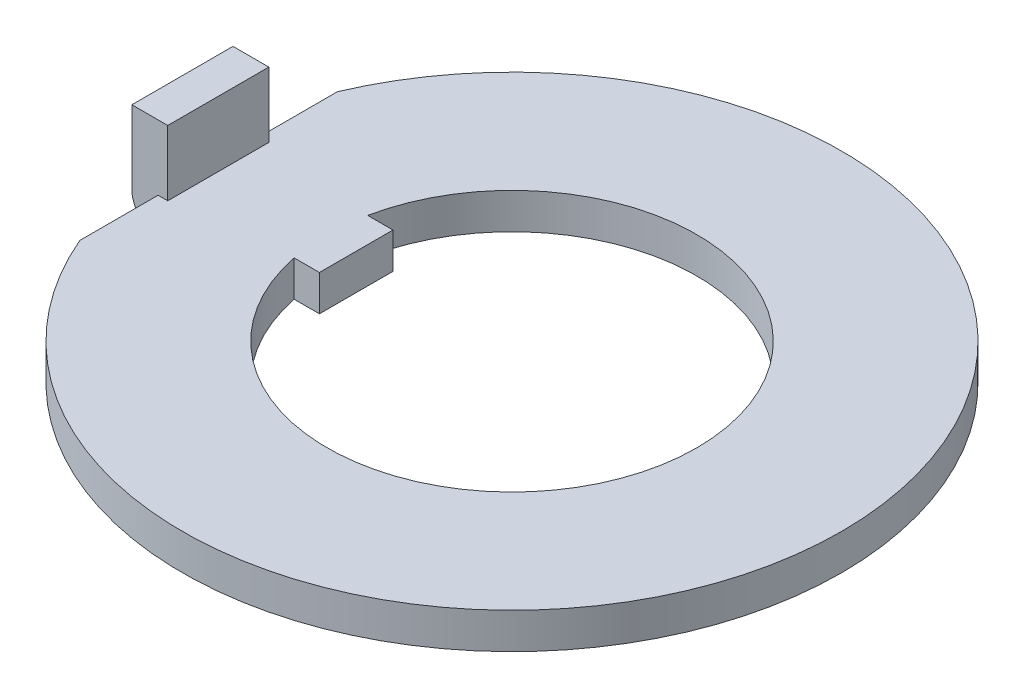
ISO-10303-21;
HEADER;
FILE_DESCRIPTION(('STEP AP214'),'2;1');
FILE_NAME('part.step','',(''),(''),'','','');
FILE_SCHEMA(('AUTOMOTIVE_DESIGN { 1 0 10303 214 1 1 1 1 }'));
ENDSEC;
DATA;
#1=APPLICATION_CONTEXT('core data for automotive mechanical design processes');
#2=APPLICATION_PROTOCOL_DEFINITION('international standard','automotive_design',2000,#1);
#3=PRODUCT_CONTEXT('',#1,'mechanical');
#4=PRODUCT('Part','Part','',(#3));
#5=PRODUCT_RELATED_PRODUCT_CATEGORY('part','',(#4));
#6=PRODUCT_DEFINITION_FORMATION('','',#4);
#7=PRODUCT_DEFINITION_CONTEXT('part definition',#1,'design');
#8=PRODUCT_DEFINITION('design','',#6,#7);
#9=PRODUCT_DEFINITION_SHAPE('','',#8);
#10=(LENGTH_UNIT() NAMED_UNIT(*) SI_UNIT(.MILLI.,.METRE.));
#11=(NAMED_UNIT(*) PLANE_ANGLE_UNIT() SI_UNIT($,.RADIAN.));
#12=(NAMED_UNIT(*) SI_UNIT($,.STERADIAN.) SOLID_ANGLE_UNIT());
#13=UNCERTAINTY_MEASURE_WITH_UNIT(LENGTH_MEASURE(1.E-05),#10,'distance_accuracy_value','');
#14=(GEOMETRIC_REPRESENTATION_CONTEXT(3) GLOBAL_UNCERTAINTY_ASSIGNED_CONTEXT((#13)) GLOBAL_UNIT_ASSIGNED_CONTEXT((#10,
#11,#12)) REPRESENTATION_CONTEXT('',''));
#15=CARTESIAN_POINT('',(0.,0.,0.));
#16=DIRECTION('',(0.,0.,1.));
#17=DIRECTION('',(1.,0.,0.));
#18=AXIS2_PLACEMENT_3D('',#15,#16,#17);
#19=CARTESIAN_POINT('',(-8.3439,0.2667,1.397));
#20=DIRECTION('',(0.,0.,1.));
#21=DIRECTION('',(1.,0.,0.));
#22=AXIS2_PLACEMENT_3D('',#19,#20,#21);
#23=PLANE('',#22);
#24=DIRECTION('',(0.,1.,0.));
#25=VECTOR('',#24,1.);
#26=CARTESIAN_POINT('',(-9.1059,2.2987,1.397));
#27=LINE('',#26,#25);
#28=CARTESIAN_POINT('',(-9.1059,2.2987,1.397));
#29=VERTEX_POINT('',#28);
#30=CARTESIAN_POINT('',(-9.1059,0.266700005677342,1.397));
#31=VERTEX_POINT('',#30);
#32=EDGE_CURVE('E205',#29,#31,#27,.F.);
#33=ORIENTED_EDGE('',*,*,#32,.T.);
#34=CARTESIAN_POINT('',(-8.3439,0.2667,1.397));
#35=DIRECTION('',(0.,0.,1.));
#36=DIRECTION('',(1.,0.,0.));
#37=AXIS2_PLACEMENT_3D('',#34,#35,#36);
#38=CIRCLE('',#37,0.762);
#39=CARTESIAN_POINT('',(-8.382,-0.494346903942195,1.397));
#40=VERTEX_POINT('',#39);
#41=EDGE_CURVE('E19',#31,#40,#38,.T.);
#42=ORIENTED_EDGE('',*,*,#41,.T.);
#43=DIRECTION('',(0.,1.,0.));
#44=VECTOR('',#43,1.);
#45=CARTESIAN_POINT('',(-8.382,0.2667,1.397));
#46=LINE('',#45,#44);
#47=CARTESIAN_POINT('',(-8.382,0.4953,1.397));
#48=VERTEX_POINT('',#47);
#49=EDGE_CURVE('E194',#40,#48,#46,.T.);
#50=ORIENTED_EDGE('',*,*,#49,.T.);
#51=DIRECTION('',(1.,0.,0.));
#52=VECTOR('',#51,1.);
#53=CARTESIAN_POINT('',(-8.3439,0.4953,1.397));
#54=LINE('',#53,#52);
#55=CARTESIAN_POINT('',(-8.1153,0.4953,1.397));
#56=VERTEX_POINT('',#55);
#57=EDGE_CURVE('E83',#48,#56,#54,.T.);
#58=ORIENTED_EDGE('',*,*,#57,.T.);
#59=DIRECTION('',(0.,1.,0.));
#60=VECTOR('',#59,1.);
#61=CARTESIAN_POINT('',(-8.1153,-0.4953,1.397));
#62=LINE('',#61,#60);
#63=CARTESIAN_POINT('',(-8.1153,2.2987,1.397));
#64=VERTEX_POINT('',#63);
#65=EDGE_CURVE('E204',#56,#64,#62,.T.);
#66=ORIENTED_EDGE('',*,*,#65,.T.);
#67=DIRECTION('',(1.,0.,0.));
#68=VECTOR('',#67,1.);
#69=CARTESIAN_POINT('',(-8.1153,2.2987,1.397));
#70=LINE('',#69,#68);
#71=EDGE_CURVE('E211',#64,#29,#70,.F.);
#72=ORIENTED_EDGE('',*,*,#71,.T.);
#73=EDGE_LOOP('',(#33,#42,#50,#58,#66,#72));
#74=FACE_BOUND('',#73,.T.);
#75=ADVANCED_FACE('F16',(#74),#23,.T.);
#76=CARTESIAN_POINT('',(-8.1153,2.2987,1.397));
#77=DIRECTION('',(0.,-1.,0.));
#78=DIRECTION('',(0.,0.,-1.));
#79=AXIS2_PLACEMENT_3D('',#76,#77,#78);
#80=PLANE('',#79);
#81=DIRECTION('',(0.,0.,-1.));
#82=VECTOR('',#81,1.);
#83=CARTESIAN_POINT('',(-9.1059,2.2987,1.397));
#84=LINE('',#83,#82);
#85=CARTESIAN_POINT('',(-9.1059,2.2987,-1.397));
#86=VERTEX_POINT('',#85);
#87=EDGE_CURVE('E214',#86,#29,#84,.F.);
#88=ORIENTED_EDGE('',*,*,#87,.T.);
#89=ORIENTED_EDGE('',*,*,#71,.F.);
#90=DIRECTION('',(0.,0.,1.));
#91=VECTOR('',#90,1.);
#92=CARTESIAN_POINT('',(-8.1153,2.2987,1.397));
#93=LINE('',#92,#91);
#94=CARTESIAN_POINT('',(-8.1153,2.2987,-1.397));
#95=VERTEX_POINT('',#94);
#96=EDGE_CURVE('E230',#64,#95,#93,.F.);
#97=ORIENTED_EDGE('',*,*,#96,.T.);
#98=DIRECTION('',(1.,0.,0.));
#99=VECTOR('',#98,1.);
#100=CARTESIAN_POINT('',(-8.3439,2.2987,-1.397));
#101=LINE('',#100,#99);
#102=EDGE_CURVE('E208',#95,#86,#101,.F.);
#103=ORIENTED_EDGE('',*,*,#102,.T.);
#104=EDGE_LOOP('',(#88,#89,#97,#103));
#105=FACE_BOUND('',#104,.T.);
#106=ADVANCED_FACE('F262',(#105),#80,.F.);
#107=CARTESIAN_POINT('',(-8.3439,0.2667,-1.397));
#108=DIRECTION('',(0.,0.,1.));
#109=DIRECTION('',(1.,0.,0.));
#110=AXIS2_PLACEMENT_3D('',#107,#108,#109);
#111=PLANE('',#110);
#112=DIRECTION('',(0.,1.,0.));
#113=VECTOR('',#112,1.);
#114=CARTESIAN_POINT('',(-8.382,0.2667,-1.397));
#115=LINE('',#114,#113);
#116=CARTESIAN_POINT('',(-8.382,-0.494346903942195,-1.397));
#117=VERTEX_POINT('',#116);
#118=CARTESIAN_POINT('',(-8.382,0.4953,-1.397));
#119=VERTEX_POINT('',#118);
#120=EDGE_CURVE('E187',#117,#119,#115,.T.);
#121=ORIENTED_EDGE('',*,*,#120,.F.);
#122=CARTESIAN_POINT('',(-8.3439,0.2667,-1.397));
#123=DIRECTION('',(0.,0.,1.));
#124=DIRECTION('',(1.,0.,0.));
#125=AXIS2_PLACEMENT_3D('',#122,#123,#124);
#126=CIRCLE('',#125,0.762);
#127=CARTESIAN_POINT('',(-9.1059,0.266700005677342,-1.397));
#128=VERTEX_POINT('',#127);
#129=EDGE_CURVE('E191',#128,#117,#126,.T.);
#130=ORIENTED_EDGE('',*,*,#129,.F.);
#131=DIRECTION('',(0.,1.,0.));
#132=VECTOR('',#131,1.);
#133=CARTESIAN_POINT('',(-9.1059,2.2987,-1.397));
#134=LINE('',#133,#132);
#135=EDGE_CURVE('E201',#128,#86,#134,.T.);
#136=ORIENTED_EDGE('',*,*,#135,.T.);
#137=ORIENTED_EDGE('',*,*,#102,.F.);
#138=DIRECTION('',(0.,1.,0.));
#139=VECTOR('',#138,1.);
#140=CARTESIAN_POINT('',(-8.1153,-0.4953,-1.397));
#141=LINE('',#140,#139);
#142=CARTESIAN_POINT('',(-8.1153,0.4953,-1.397));
#143=VERTEX_POINT('',#142);
#144=EDGE_CURVE('E200',#95,#143,#141,.F.);
#145=ORIENTED_EDGE('',*,*,#144,.T.);
#146=DIRECTION('',(1.,0.,0.));
#147=VECTOR('',#146,1.);
#148=CARTESIAN_POINT('',(-8.3439,0.4953,-1.397));
#149=LINE('',#148,#147);
#150=EDGE_CURVE('E190',#119,#143,#149,.T.);
#151=ORIENTED_EDGE('',*,*,#150,.F.);
#152=EDGE_LOOP('',(#121,#130,#136,#137,#145,#151));
#153=FACE_BOUND('',#152,.T.);
#154=ADVANCED_FACE('F257',(#153),#111,.F.);
#155=CARTESIAN_POINT('',(-9.1059,2.2987,1.397));
#156=DIRECTION('',(1.,0.,0.));
#157=DIRECTION('',(0.,0.,-1.));
#158=AXIS2_PLACEMENT_3D('',#155,#156,#157);
#159=PLANE('',#158);
#160=DIRECTION('',(0.,0.,1.));
#161=VECTOR('',#160,1.);
#162=CARTESIAN_POINT('',(-9.1059,0.266700011354684,1.397));
#163=LINE('',#162,#161);
#164=EDGE_CURVE('E198',#31,#128,#163,.F.);
#165=ORIENTED_EDGE('',*,*,#164,.F.);
#166=ORIENTED_EDGE('',*,*,#32,.F.);
#167=ORIENTED_EDGE('',*,*,#87,.F.);
#168=ORIENTED_EDGE('',*,*,#135,.F.);
#169=EDGE_LOOP('',(#165,#166,#167,#168));
#170=FACE_BOUND('',#169,.T.);
#171=ADVANCED_FACE('F259',(#170),#159,.F.);
#172=CARTESIAN_POINT('',(-8.1153,-0.4953,1.397));
#173=DIRECTION('',(-1.,0.,0.));
#174=DIRECTION('',(0.,0.,1.));
#175=AXIS2_PLACEMENT_3D('',#172,#173,#174);
#176=PLANE('',#175);
#177=ORIENTED_EDGE('',*,*,#144,.F.);
#178=ORIENTED_EDGE('',*,*,#96,.F.);
#179=ORIENTED_EDGE('',*,*,#65,.F.);
#180=DIRECTION('',(0.,0.,1.));
#181=VECTOR('',#180,1.);
#182=CARTESIAN_POINT('',(-8.1153,0.4953,0.));
#183=LINE('',#182,#181);
#184=EDGE_CURVE('E181',#143,#56,#183,.T.);
#185=ORIENTED_EDGE('',*,*,#184,.F.);
#186=EDGE_LOOP('',(#177,#178,#179,#185));
#187=FACE_BOUND('',#186,.T.);
#188=ADVANCED_FACE('F267',(#187),#176,.F.);
#189=CARTESIAN_POINT('',(-8.3439,0.2667,1.397));
#190=DIRECTION('',(0.,0.,1.));
#191=DIRECTION('',(1.,0.,0.));
#192=AXIS2_PLACEMENT_3D('',#189,#190,#191);
#193=CYLINDRICAL_SURFACE('',#192,0.762);
#194=ORIENTED_EDGE('',*,*,#41,.F.);
#195=ORIENTED_EDGE('',*,*,#164,.T.);
#196=ORIENTED_EDGE('',*,*,#129,.T.);
#197=DIRECTION('',(0.,0.,-1.));
#198=VECTOR('',#197,1.);
#199=CARTESIAN_POINT('',(-8.382,-0.494346903942195,-3.55801782036008));
#200=LINE('',#199,#198);
#201=EDGE_CURVE('E170',#117,#40,#200,.F.);
#202=ORIENTED_EDGE('',*,*,#201,.T.);
#203=EDGE_LOOP('',(#194,#195,#196,#202));
#204=FACE_BOUND('',#203,.T.);
#205=ADVANCED_FACE('F251',(#204),#193,.T.);
#206=CARTESIAN_POINT('',(0.,0.4953,0.));
#207=DIRECTION('',(0.,1.,0.));
#208=DIRECTION('',(0.,0.,1.));
#209=AXIS2_PLACEMENT_3D('',#206,#207,#208);
#210=PLANE('',#209);
#211=DIRECTION('',(-1.,0.,0.));
#212=VECTOR('',#211,1.);
#213=CARTESIAN_POINT('',(-5.00328423737849,0.4953,-1.016));
#214=LINE('',#213,#212);
#215=CARTESIAN_POINT('',(-5.00328423737849,0.4953,-1.016));
#216=VERTEX_POINT('',#215);
#217=CARTESIAN_POINT('',(-4.3053,0.4953,-1.016));
#218=VERTEX_POINT('',#217);
#219=EDGE_CURVE('E165',#216,#218,#214,.F.);
#220=ORIENTED_EDGE('',*,*,#219,.F.);
#221=CARTESIAN_POINT('',(0.,0.4953,0.));
#222=DIRECTION('',(0.,1.,0.));
#223=DIRECTION('',(0.,0.,1.));
#224=AXIS2_PLACEMENT_3D('',#221,#222,#223);
#225=CIRCLE('',#224,5.1054);
#226=CARTESIAN_POINT('',(-5.00328423737849,0.4953,1.016));
#227=VERTEX_POINT('',#226);
#228=EDGE_CURVE('E132',#216,#227,#225,.F.);
#229=ORIENTED_EDGE('',*,*,#228,.T.);
#230=DIRECTION('',(1.,0.,0.));
#231=VECTOR('',#230,1.);
#232=CARTESIAN_POINT('',(-4.3053,0.4953,1.016));
#233=LINE('',#232,#231);
#234=CARTESIAN_POINT('',(-4.3053,0.4953,1.016));
#235=VERTEX_POINT('',#234);
#236=EDGE_CURVE('E131',#235,#227,#233,.F.);
#237=ORIENTED_EDGE('',*,*,#236,.F.);
#238=DIRECTION('',(0.,0.,-1.));
#239=VECTOR('',#238,1.);
#240=CARTESIAN_POINT('',(-4.3053,0.4953,-1.016));
#241=LINE('',#240,#239);
#242=EDGE_CURVE('E128',#218,#235,#241,.F.);
#243=ORIENTED_EDGE('',*,*,#242,.F.);
#244=EDGE_LOOP('',(#220,#229,#237,#243));
#245=FACE_BOUND('',#244,.T.);
#246=ORIENTED_EDGE('',*,*,#150,.T.);
#247=ORIENTED_EDGE('',*,*,#184,.T.);
#248=ORIENTED_EDGE('',*,*,#57,.F.);
#249=DIRECTION('',(0.,0.,-1.));
#250=VECTOR('',#249,1.);
#251=CARTESIAN_POINT('',(-8.382,0.4953,-3.55801782036008));
#252=LINE('',#251,#250);
#253=CARTESIAN_POINT('',(-8.382,0.4953,3.55801782036009));
#254=VERTEX_POINT('',#253);
#255=EDGE_CURVE('E153',#48,#254,#252,.F.);
#256=ORIENTED_EDGE('',*,*,#255,.T.);
#257=CARTESIAN_POINT('',(0.,0.4953,0.));
#258=DIRECTION('',(0.,1.,0.));
#259=DIRECTION('',(0.,0.,1.));
#260=AXIS2_PLACEMENT_3D('',#257,#258,#259);
#261=CIRCLE('',#260,9.1059);
#262=CARTESIAN_POINT('',(-8.382,0.4953,-3.55801782036009));
#263=VERTEX_POINT('',#262);
#264=EDGE_CURVE('E149',#263,#254,#261,.F.);
#265=ORIENTED_EDGE('',*,*,#264,.F.);
#266=DIRECTION('',(0.,0.,-1.));
#267=VECTOR('',#266,1.);
#268=CARTESIAN_POINT('',(-8.382,0.4953,-3.55801782036008));
#269=LINE('',#268,#267);
#270=EDGE_CURVE('E154',#263,#119,#269,.F.);
#271=ORIENTED_EDGE('',*,*,#270,.T.);
#272=EDGE_LOOP('',(#246,#247,#248,#256,#265,#271));
#273=FACE_BOUND('',#272,.T.);
#274=ADVANCED_FACE('F269',(#245,#273),#210,.T.);
#275=CARTESIAN_POINT('',(-4.3053,0.4953,-1.016));
#276=DIRECTION('',(1.,0.,0.));
#277=DIRECTION('',(0.,0.,-1.));
#278=AXIS2_PLACEMENT_3D('',#275,#276,#277);
#279=PLANE('',#278);
#280=ORIENTED_EDGE('',*,*,#242,.T.);
#281=DIRECTION('',(0.,1.,0.));
#282=VECTOR('',#281,1.);
#283=CARTESIAN_POINT('',(-4.3053,0.4953,1.016));
#284=LINE('',#283,#282);
#285=CARTESIAN_POINT('',(-4.3053,-0.4953,1.016));
#286=VERTEX_POINT('',#285);
#287=EDGE_CURVE('E125',#286,#235,#284,.T.);
#288=ORIENTED_EDGE('',*,*,#287,.F.);
#289=DIRECTION('',(0.,0.,1.));
#290=VECTOR('',#289,1.);
#291=CARTESIAN_POINT('',(-4.3053,-0.4953,0.));
#292=LINE('',#291,#290);
#293=CARTESIAN_POINT('',(-4.3053,-0.4953,-1.016));
#294=VERTEX_POINT('',#293);
#295=EDGE_CURVE('E112',#286,#294,#292,.F.);
#296=ORIENTED_EDGE('',*,*,#295,.T.);
#297=DIRECTION('',(0.,1.,0.));
#298=VECTOR('',#297,1.);
#299=CARTESIAN_POINT('',(-4.3053,0.4953,-1.016));
#300=LINE('',#299,#298);
#301=EDGE_CURVE('E163',#218,#294,#300,.F.);
#302=ORIENTED_EDGE('',*,*,#301,.F.);
#303=EDGE_LOOP('',(#280,#288,#296,#302));
#304=FACE_BOUND('',#303,.T.);
#305=ADVANCED_FACE('F126',(#304),#279,.T.);
#306=CARTESIAN_POINT('',(-5.00328423737849,0.4953,-1.016));
#307=DIRECTION('',(0.,0.,-1.));
#308=DIRECTION('',(-1.,0.,0.));
#309=AXIS2_PLACEMENT_3D('',#306,#307,#308);
#310=PLANE('',#309);
#311=ORIENTED_EDGE('',*,*,#219,.T.);
#312=ORIENTED_EDGE('',*,*,#301,.T.);
#313=DIRECTION('',(1.,0.,0.));
#314=VECTOR('',#313,1.);
#315=CARTESIAN_POINT('',(0.,-0.4953,-1.016));
#316=LINE('',#315,#314);
#317=CARTESIAN_POINT('',(-5.00328423737849,-0.4953,-1.016));
#318=VERTEX_POINT('',#317);
#319=EDGE_CURVE('E120',#294,#318,#316,.F.);
#320=ORIENTED_EDGE('',*,*,#319,.T.);
#321=DIRECTION('',(0.,1.,0.));
#322=VECTOR('',#321,1.);
#323=CARTESIAN_POINT('',(-5.00328423737849,0.4953,-1.016));
#324=LINE('',#323,#322);
#325=EDGE_CURVE('E160',#318,#216,#324,.T.);
#326=ORIENTED_EDGE('',*,*,#325,.T.);
#327=EDGE_LOOP('',(#311,#312,#320,#326));
#328=FACE_BOUND('',#327,.T.);
#329=ADVANCED_FACE('F296',(#328),#310,.T.);
#330=CARTESIAN_POINT('',(0.,0.4953,0.));
#331=DIRECTION('',(0.,1.,0.));
#332=DIRECTION('',(0.,0.,1.));
#333=AXIS2_PLACEMENT_3D('',#330,#331,#332);
#334=CYLINDRICAL_SURFACE('',#333,5.1054);
#335=DIRECTION('',(0.,1.,0.));
#336=VECTOR('',#335,1.);
#337=CARTESIAN_POINT('',(-5.00328423737849,0.4953,1.016));
#338=LINE('',#337,#336);
#339=CARTESIAN_POINT('',(-5.00328423737849,-0.4953,1.016));
#340=VERTEX_POINT('',#339);
#341=EDGE_CURVE('E136',#227,#340,#338,.F.);
#342=ORIENTED_EDGE('',*,*,#341,.F.);
#343=ORIENTED_EDGE('',*,*,#228,.F.);
#344=ORIENTED_EDGE('',*,*,#325,.F.);
#345=CARTESIAN_POINT('',(0.,-0.4953,0.));
#346=DIRECTION('',(0.,1.,0.));
#347=DIRECTION('',(0.,0.,1.));
#348=AXIS2_PLACEMENT_3D('',#345,#346,#347);
#349=CIRCLE('',#348,5.1054);
#350=EDGE_CURVE('E137',#318,#340,#349,.F.);
#351=ORIENTED_EDGE('',*,*,#350,.T.);
#352=EDGE_LOOP('',(#342,#343,#344,#351));
#353=FACE_BOUND('',#352,.T.);
#354=ADVANCED_FACE('F293',(#353),#334,.F.);
#355=CARTESIAN_POINT('',(-4.3053,0.4953,1.016));
#356=DIRECTION('',(0.,0.,1.));
#357=DIRECTION('',(1.,0.,0.));
#358=AXIS2_PLACEMENT_3D('',#355,#356,#357);
#359=PLANE('',#358);
#360=ORIENTED_EDGE('',*,*,#236,.T.);
#361=ORIENTED_EDGE('',*,*,#341,.T.);
#362=DIRECTION('',(1.,0.,0.));
#363=VECTOR('',#362,1.);
#364=CARTESIAN_POINT('',(0.,-0.4953,1.016));
#365=LINE('',#364,#363);
#366=EDGE_CURVE('E117',#340,#286,#365,.T.);
#367=ORIENTED_EDGE('',*,*,#366,.T.);
#368=ORIENTED_EDGE('',*,*,#287,.T.);
#369=EDGE_LOOP('',(#360,#361,#367,#368));
#370=FACE_BOUND('',#369,.T.);
#371=ADVANCED_FACE('F134',(#370),#359,.T.);
#372=CARTESIAN_POINT('',(-8.382,0.4953,-3.55801782036008));
#373=DIRECTION('',(1.,0.,0.));
#374=DIRECTION('',(0.,0.,-1.));
#375=AXIS2_PLACEMENT_3D('',#372,#373,#374);
#376=PLANE('',#375);
#377=ORIENTED_EDGE('',*,*,#49,.F.);
#378=ORIENTED_EDGE('',*,*,#201,.F.);
#379=ORIENTED_EDGE('',*,*,#120,.T.);
#380=ORIENTED_EDGE('',*,*,#270,.F.);
#381=DIRECTION('',(0.,1.,0.));
#382=VECTOR('',#381,1.);
#383=CARTESIAN_POINT('',(-8.382,0.4953,-3.55801782036008));
#384=LINE('',#383,#382);
#385=CARTESIAN_POINT('',(-8.382,-0.4953,-3.55801782036009));
#386=VERTEX_POINT('',#385);
#387=EDGE_CURVE('E150',#386,#263,#384,.T.);
#388=ORIENTED_EDGE('',*,*,#387,.F.);
#389=DIRECTION('',(0.,0.,1.));
#390=VECTOR('',#389,1.);
#391=CARTESIAN_POINT('',(-8.382,-0.4953,0.));
#392=LINE('',#391,#390);
#393=CARTESIAN_POINT('',(-8.382,-0.4953,3.55801782036009));
#394=VERTEX_POINT('',#393);
#395=EDGE_CURVE('E25',#386,#394,#392,.T.);
#396=ORIENTED_EDGE('',*,*,#395,.T.);
#397=DIRECTION('',(0.,1.,0.));
#398=VECTOR('',#397,1.);
#399=CARTESIAN_POINT('',(-8.38200000000001,0.4953,3.55801782036008));
#400=LINE('',#399,#398);
#401=EDGE_CURVE('E33',#254,#394,#400,.F.);
#402=ORIENTED_EDGE('',*,*,#401,.F.);
#403=ORIENTED_EDGE('',*,*,#255,.F.);
#404=EDGE_LOOP('',(#377,#378,#379,#380,#388,#396,#402,#403));
#405=FACE_BOUND('',#404,.T.);
#406=ADVANCED_FACE('F273',(#405),#376,.F.);
#407=CARTESIAN_POINT('',(0.,0.4953,0.));
#408=DIRECTION('',(0.,1.,0.));
#409=DIRECTION('',(0.,0.,1.));
#410=AXIS2_PLACEMENT_3D('',#407,#408,#409);
#411=CYLINDRICAL_SURFACE('',#410,9.1059);
#412=ORIENTED_EDGE('',*,*,#264,.T.);
#413=ORIENTED_EDGE('',*,*,#401,.T.);
#414=CARTESIAN_POINT('',(0.,-0.4953,0.));
#415=DIRECTION('',(0.,1.,0.));
#416=DIRECTION('',(0.,0.,1.));
#417=AXIS2_PLACEMENT_3D('',#414,#415,#416);
#418=CIRCLE('',#417,9.1059);
#419=EDGE_CURVE('E11',#394,#386,#418,.T.);
#420=ORIENTED_EDGE('',*,*,#419,.T.);
#421=ORIENTED_EDGE('',*,*,#387,.T.);
#422=EDGE_LOOP('',(#412,#413,#420,#421));
#423=FACE_BOUND('',#422,.T.);
#424=ADVANCED_FACE('F281',(#423),#411,.T.);
#425=CARTESIAN_POINT('',(0.,-0.4953,0.));
#426=DIRECTION('',(0.,1.,0.));
#427=DIRECTION('',(0.,0.,1.));
#428=AXIS2_PLACEMENT_3D('',#425,#426,#427);
#429=PLANE('',#428);
#430=ORIENTED_EDGE('',*,*,#395,.F.);
#431=ORIENTED_EDGE('',*,*,#419,.F.);
#432=EDGE_LOOP('',(#430,#431));
#433=FACE_BOUND('',#432,.T.);
#434=ORIENTED_EDGE('',*,*,#350,.F.);
#435=ORIENTED_EDGE('',*,*,#319,.F.);
#436=ORIENTED_EDGE('',*,*,#295,.F.);
#437=ORIENTED_EDGE('',*,*,#366,.F.);
#438=EDGE_LOOP('',(#434,#435,#436,#437));
#439=FACE_BOUND('',#438,.T.);
#440=ADVANCED_FACE('F115',(#433,#439),#429,.F.);
#441=CLOSED_SHELL('',(#75,#106,#154,#171,#188,#205,#274,#305,#329,#354,#371,#406,#424,#440));
#442=MANIFOLD_SOLID_BREP('B1',#441);
#443=ADVANCED_BREP_SHAPE_REPRESENTATION('',(#18,#442),#14);
#444=SHAPE_DEFINITION_REPRESENTATION(#9,#443);
ENDSEC;
END-ISO-10303-21;
